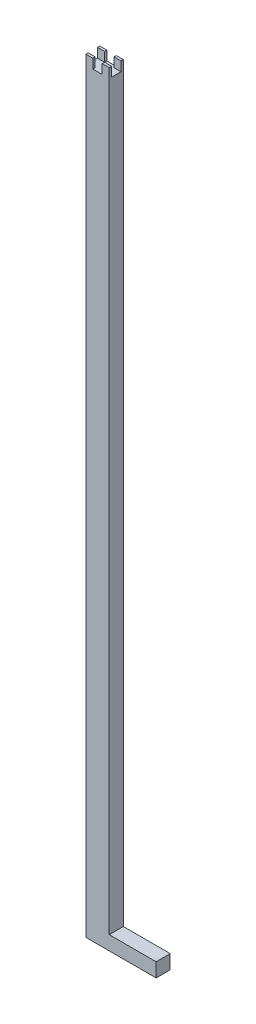
ISO-10303-21;
HEADER;
FILE_DESCRIPTION(('STEP AP214'),'2;1');
FILE_NAME('part.step','',(''),(''),'','','');
FILE_SCHEMA(('AUTOMOTIVE_DESIGN { 1 0 10303 214 1 1 1 1 }'));
ENDSEC;
DATA;
#1=APPLICATION_CONTEXT('core data for automotive mechanical design processes');
#2=APPLICATION_PROTOCOL_DEFINITION('international standard','automotive_design',2000,#1);
#3=PRODUCT_CONTEXT('',#1,'mechanical');
#4=PRODUCT('Part','Part','',(#3));
#5=PRODUCT_RELATED_PRODUCT_CATEGORY('part','',(#4));
#6=PRODUCT_DEFINITION_FORMATION('','',#4);
#7=PRODUCT_DEFINITION_CONTEXT('part definition',#1,'design');
#8=PRODUCT_DEFINITION('design','',#6,#7);
#9=PRODUCT_DEFINITION_SHAPE('','',#8);
#10=(LENGTH_UNIT() NAMED_UNIT(*) SI_UNIT(.MILLI.,.METRE.));
#11=(NAMED_UNIT(*) PLANE_ANGLE_UNIT() SI_UNIT($,.RADIAN.));
#12=(NAMED_UNIT(*) SI_UNIT($,.STERADIAN.) SOLID_ANGLE_UNIT());
#13=UNCERTAINTY_MEASURE_WITH_UNIT(LENGTH_MEASURE(1.E-05),#10,'distance_accuracy_value','');
#14=(GEOMETRIC_REPRESENTATION_CONTEXT(3) GLOBAL_UNCERTAINTY_ASSIGNED_CONTEXT((#13)) GLOBAL_UNIT_ASSIGNED_CONTEXT((#10,
#11,#12)) REPRESENTATION_CONTEXT('',''));
#15=CARTESIAN_POINT('',(0.,0.,0.));
#16=DIRECTION('',(0.,0.,1.));
#17=DIRECTION('',(1.,0.,0.));
#18=AXIS2_PLACEMENT_3D('',#15,#16,#17);
#19=CARTESIAN_POINT('',(0.,163.,0.));
#20=DIRECTION('',(0.,1.,0.));
#21=DIRECTION('',(0.,0.,1.));
#22=AXIS2_PLACEMENT_3D('',#19,#20,#21);
#23=PLANE('',#22);
#24=DIRECTION('',(0.,0.,-1.));
#25=VECTOR('',#24,1.);
#26=CARTESIAN_POINT('',(-4.,163.,-0.999999999999999));
#27=LINE('',#26,#25);
#28=CARTESIAN_POINT('',(-4.,163.,-0.999999999999999));
#29=VERTEX_POINT('',#28);
#30=CARTESIAN_POINT('',(-4.,163.,-1.5));
#31=VERTEX_POINT('',#30);
#32=EDGE_CURVE('E180',#29,#31,#27,.T.);
#33=ORIENTED_EDGE('',*,*,#32,.F.);
#34=DIRECTION('',(-1.,0.,0.));
#35=VECTOR('',#34,1.);
#36=CARTESIAN_POINT('',(-2.5,163.,-0.999999999999999));
#37=LINE('',#36,#35);
#38=CARTESIAN_POINT('',(-2.5,163.,-0.999999999999999));
#39=VERTEX_POINT('',#38);
#40=EDGE_CURVE('E182',#39,#29,#37,.T.);
#41=ORIENTED_EDGE('',*,*,#40,.F.);
#42=DIRECTION('',(0.,0.,-1.));
#43=VECTOR('',#42,1.);
#44=CARTESIAN_POINT('',(-2.5,163.,-1.5));
#45=LINE('',#44,#43);
#46=CARTESIAN_POINT('',(-2.5,163.,-1.5));
#47=VERTEX_POINT('',#46);
#48=EDGE_CURVE('E257',#39,#47,#45,.T.);
#49=ORIENTED_EDGE('',*,*,#48,.T.);
#50=DIRECTION('',(-1.,0.,0.));
#51=VECTOR('',#50,1.);
#52=CARTESIAN_POINT('',(-7.5,163.,-1.5));
#53=LINE('',#52,#51);
#54=EDGE_CURVE('E262',#47,#31,#53,.T.);
#55=ORIENTED_EDGE('',*,*,#54,.T.);
#56=EDGE_LOOP('',(#33,#41,#49,#55));
#57=FACE_BOUND('',#56,.T.);
#58=ADVANCED_FACE('F34',(#57),#23,.T.);
#59=DIRECTION('',(1.,0.,0.));
#60=VECTOR('',#59,1.);
#61=CARTESIAN_POINT('',(-2.5,163.,1.));
#62=LINE('',#61,#60);
#63=CARTESIAN_POINT('',(-4.,163.,1.));
#64=VERTEX_POINT('',#63);
#65=CARTESIAN_POINT('',(-2.5,163.,1.));
#66=VERTEX_POINT('',#65);
#67=EDGE_CURVE('E221',#64,#66,#62,.T.);
#68=ORIENTED_EDGE('',*,*,#67,.F.);
#69=DIRECTION('',(0.,0.,-1.));
#70=VECTOR('',#69,1.);
#71=CARTESIAN_POINT('',(-4.,163.,1.5));
#72=LINE('',#71,#70);
#73=CARTESIAN_POINT('',(-4.,163.,1.5));
#74=VERTEX_POINT('',#73);
#75=EDGE_CURVE('E218',#74,#64,#72,.T.);
#76=ORIENTED_EDGE('',*,*,#75,.F.);
#77=DIRECTION('',(1.,0.,0.));
#78=VECTOR('',#77,1.);
#79=CARTESIAN_POINT('',(-7.5,163.,1.5));
#80=LINE('',#79,#78);
#81=CARTESIAN_POINT('',(-2.5,163.,1.5));
#82=VERTEX_POINT('',#81);
#83=EDGE_CURVE('E252',#74,#82,#80,.T.);
#84=ORIENTED_EDGE('',*,*,#83,.T.);
#85=EDGE_CURVE('E258',#82,#66,#45,.T.);
#86=ORIENTED_EDGE('',*,*,#85,.T.);
#87=EDGE_LOOP('',(#68,#76,#84,#86));
#88=FACE_BOUND('',#87,.T.);
#89=ADVANCED_FACE('F334',(#88),#23,.T.);
#90=DIRECTION('',(0.,0.,1.));
#91=VECTOR('',#90,1.);
#92=CARTESIAN_POINT('',(-6.,163.,1.5));
#93=LINE('',#92,#91);
#94=CARTESIAN_POINT('',(-6.,163.,1.));
#95=VERTEX_POINT('',#94);
#96=CARTESIAN_POINT('',(-6.,163.,1.5));
#97=VERTEX_POINT('',#96);
#98=EDGE_CURVE('E216',#95,#97,#93,.T.);
#99=ORIENTED_EDGE('',*,*,#98,.F.);
#100=DIRECTION('',(1.,0.,0.));
#101=VECTOR('',#100,1.);
#102=CARTESIAN_POINT('',(-6.,163.,1.));
#103=LINE('',#102,#101);
#104=CARTESIAN_POINT('',(-7.5,163.,1.));
#105=VERTEX_POINT('',#104);
#106=EDGE_CURVE('E213',#105,#95,#103,.T.);
#107=ORIENTED_EDGE('',*,*,#106,.F.);
#108=DIRECTION('',(0.,0.,1.));
#109=VECTOR('',#108,1.);
#110=CARTESIAN_POINT('',(-7.5,163.,-1.5));
#111=LINE('',#110,#109);
#112=CARTESIAN_POINT('',(-7.5,163.,1.5));
#113=VERTEX_POINT('',#112);
#114=EDGE_CURVE('E253',#105,#113,#111,.T.);
#115=ORIENTED_EDGE('',*,*,#114,.T.);
#116=EDGE_CURVE('E254',#113,#97,#80,.T.);
#117=ORIENTED_EDGE('',*,*,#116,.T.);
#118=EDGE_LOOP('',(#99,#107,#115,#117));
#119=FACE_BOUND('',#118,.T.);
#120=ADVANCED_FACE('F347',(#119),#23,.T.);
#121=CARTESIAN_POINT('',(-7.5,3.,1.5));
#122=DIRECTION('',(1.,0.,0.));
#123=DIRECTION('',(0.,0.,-1.));
#124=AXIS2_PLACEMENT_3D('',#121,#122,#123);
#125=PLANE('',#124);
#126=ORIENTED_EDGE('',*,*,#114,.F.);
#127=DIRECTION('',(0.,1.,0.));
#128=VECTOR('',#127,1.);
#129=CARTESIAN_POINT('',(-7.5,161.,1.));
#130=LINE('',#129,#128);
#131=CARTESIAN_POINT('',(-7.5,161.,1.));
#132=VERTEX_POINT('',#131);
#133=EDGE_CURVE('E246',#132,#105,#130,.T.);
#134=ORIENTED_EDGE('',*,*,#133,.F.);
#135=DIRECTION('',(0.,0.,1.));
#136=VECTOR('',#135,1.);
#137=CARTESIAN_POINT('',(-7.5,161.,1.));
#138=LINE('',#137,#136);
#139=CARTESIAN_POINT('',(-7.5,161.,-0.999999999999999));
#140=VERTEX_POINT('',#139);
#141=EDGE_CURVE('E174',#140,#132,#138,.T.);
#142=ORIENTED_EDGE('',*,*,#141,.F.);
#143=DIRECTION('',(0.,1.,0.));
#144=VECTOR('',#143,1.);
#145=CARTESIAN_POINT('',(-7.5,161.,-0.999999999999999));
#146=LINE('',#145,#144);
#147=CARTESIAN_POINT('',(-7.5,163.,-0.999999999999999));
#148=VERTEX_POINT('',#147);
#149=EDGE_CURVE('E164',#140,#148,#146,.T.);
#150=ORIENTED_EDGE('',*,*,#149,.T.);
#151=CARTESIAN_POINT('',(-7.5,163.,-1.5));
#152=VERTEX_POINT('',#151);
#153=EDGE_CURVE('E249',#152,#148,#111,.T.);
#154=ORIENTED_EDGE('',*,*,#153,.F.);
#155=DIRECTION('',(0.,-1.,0.));
#156=VECTOR('',#155,1.);
#157=CARTESIAN_POINT('',(-7.5,3.,-1.5));
#158=LINE('',#157,#156);
#159=CARTESIAN_POINT('',(-7.5,0.,-1.5));
#160=VERTEX_POINT('',#159);
#161=EDGE_CURVE('E280',#152,#160,#158,.T.);
#162=ORIENTED_EDGE('',*,*,#161,.T.);
#163=DIRECTION('',(0.,0.,1.));
#164=VECTOR('',#163,1.);
#165=CARTESIAN_POINT('',(-7.5,0.,1.5));
#166=LINE('',#165,#164);
#167=CARTESIAN_POINT('',(-7.5,0.,1.5));
#168=VERTEX_POINT('',#167);
#169=EDGE_CURVE('E272',#160,#168,#166,.T.);
#170=ORIENTED_EDGE('',*,*,#169,.T.);
#171=DIRECTION('',(0.,-1.,0.));
#172=VECTOR('',#171,1.);
#173=CARTESIAN_POINT('',(-7.5,3.,1.5));
#174=LINE('',#173,#172);
#175=EDGE_CURVE('E11',#113,#168,#174,.T.);
#176=ORIENTED_EDGE('',*,*,#175,.F.);
#177=EDGE_LOOP('',(#126,#134,#142,#150,#154,#162,#170,#176));
#178=FACE_BOUND('',#177,.T.);
#179=ADVANCED_FACE('F36',(#178),#125,.F.);
#180=CARTESIAN_POINT('',(7.5,3.,1.5));
#181=DIRECTION('',(0.,0.,-1.));
#182=DIRECTION('',(-1.,0.,0.));
#183=AXIS2_PLACEMENT_3D('',#180,#181,#182);
#184=PLANE('',#183);
#185=ORIENTED_EDGE('',*,*,#83,.F.);
#186=DIRECTION('',(0.,1.,0.));
#187=VECTOR('',#186,1.);
#188=CARTESIAN_POINT('',(-4.,161.,1.5));
#189=LINE('',#188,#187);
#190=CARTESIAN_POINT('',(-4.,161.,1.5));
#191=VERTEX_POINT('',#190);
#192=EDGE_CURVE('E239',#191,#74,#189,.T.);
#193=ORIENTED_EDGE('',*,*,#192,.F.);
#194=DIRECTION('',(1.,0.,0.));
#195=VECTOR('',#194,1.);
#196=CARTESIAN_POINT('',(-4.,161.,1.5));
#197=LINE('',#196,#195);
#198=CARTESIAN_POINT('',(-6.,161.,1.5));
#199=VERTEX_POINT('',#198);
#200=EDGE_CURVE('E192',#199,#191,#197,.T.);
#201=ORIENTED_EDGE('',*,*,#200,.F.);
#202=DIRECTION('',(0.,1.,0.));
#203=VECTOR('',#202,1.);
#204=CARTESIAN_POINT('',(-6.,161.,1.5));
#205=LINE('',#204,#203);
#206=EDGE_CURVE('E241',#199,#97,#205,.T.);
#207=ORIENTED_EDGE('',*,*,#206,.T.);
#208=ORIENTED_EDGE('',*,*,#116,.F.);
#209=ORIENTED_EDGE('',*,*,#175,.T.);
#210=DIRECTION('',(1.,0.,0.));
#211=VECTOR('',#210,1.);
#212=CARTESIAN_POINT('',(7.5,0.,1.5));
#213=LINE('',#212,#211);
#214=CARTESIAN_POINT('',(7.5,0.,1.5));
#215=VERTEX_POINT('',#214);
#216=EDGE_CURVE('E283',#168,#215,#213,.T.);
#217=ORIENTED_EDGE('',*,*,#216,.T.);
#218=DIRECTION('',(0.,-1.,0.));
#219=VECTOR('',#218,1.);
#220=CARTESIAN_POINT('',(7.5,3.,1.5));
#221=LINE('',#220,#219);
#222=CARTESIAN_POINT('',(7.5,3.,1.5));
#223=VERTEX_POINT('',#222);
#224=EDGE_CURVE('E42',#223,#215,#221,.T.);
#225=ORIENTED_EDGE('',*,*,#224,.F.);
#226=DIRECTION('',(1.,0.,0.));
#227=VECTOR('',#226,1.);
#228=CARTESIAN_POINT('',(7.5,3.,1.5));
#229=LINE('',#228,#227);
#230=CARTESIAN_POINT('',(-2.5,3.,1.5));
#231=VERTEX_POINT('',#230);
#232=EDGE_CURVE('E273',#231,#223,#229,.T.);
#233=ORIENTED_EDGE('',*,*,#232,.F.);
#234=DIRECTION('',(0.,-1.,0.));
#235=VECTOR('',#234,1.);
#236=CARTESIAN_POINT('',(-2.5,163.,1.5));
#237=LINE('',#236,#235);
#238=EDGE_CURVE('E269',#82,#231,#237,.T.);
#239=ORIENTED_EDGE('',*,*,#238,.F.);
#240=EDGE_LOOP('',(#185,#193,#201,#207,#208,#209,#217,#225,#233,#239));
#241=FACE_BOUND('',#240,.T.);
#242=ADVANCED_FACE('F329',(#241),#184,.F.);
#243=CARTESIAN_POINT('',(7.5,3.,1.5));
#244=DIRECTION('',(-1.,0.,0.));
#245=DIRECTION('',(0.,0.,1.));
#246=AXIS2_PLACEMENT_3D('',#243,#244,#245);
#247=PLANE('',#246);
#248=DIRECTION('',(0.,0.,-1.));
#249=VECTOR('',#248,1.);
#250=CARTESIAN_POINT('',(7.5,0.,1.5));
#251=LINE('',#250,#249);
#252=CARTESIAN_POINT('',(7.5,0.,-1.5));
#253=VERTEX_POINT('',#252);
#254=EDGE_CURVE('E285',#215,#253,#251,.T.);
#255=ORIENTED_EDGE('',*,*,#254,.T.);
#256=DIRECTION('',(0.,-1.,0.));
#257=VECTOR('',#256,1.);
#258=CARTESIAN_POINT('',(7.5,3.,-1.5));
#259=LINE('',#258,#257);
#260=CARTESIAN_POINT('',(7.5,3.,-1.5));
#261=VERTEX_POINT('',#260);
#262=EDGE_CURVE('E290',#261,#253,#259,.T.);
#263=ORIENTED_EDGE('',*,*,#262,.F.);
#264=DIRECTION('',(0.,0.,-1.));
#265=VECTOR('',#264,1.);
#266=CARTESIAN_POINT('',(7.5,3.,1.5));
#267=LINE('',#266,#265);
#268=EDGE_CURVE('E275',#223,#261,#267,.T.);
#269=ORIENTED_EDGE('',*,*,#268,.F.);
#270=ORIENTED_EDGE('',*,*,#224,.T.);
#271=EDGE_LOOP('',(#255,#263,#269,#270));
#272=FACE_BOUND('',#271,.T.);
#273=ADVANCED_FACE('F297',(#272),#247,.F.);
#274=CARTESIAN_POINT('',(7.5,3.,-1.5));
#275=DIRECTION('',(0.,0.,1.));
#276=DIRECTION('',(1.,0.,0.));
#277=AXIS2_PLACEMENT_3D('',#274,#275,#276);
#278=PLANE('',#277);
#279=CARTESIAN_POINT('',(-6.,163.,-1.5));
#280=VERTEX_POINT('',#279);
#281=EDGE_CURVE('E261',#280,#152,#53,.T.);
#282=ORIENTED_EDGE('',*,*,#281,.F.);
#283=DIRECTION('',(0.,1.,0.));
#284=VECTOR('',#283,1.);
#285=CARTESIAN_POINT('',(-6.,161.,-1.5));
#286=LINE('',#285,#284);
#287=CARTESIAN_POINT('',(-6.,161.,-1.5));
#288=VERTEX_POINT('',#287);
#289=EDGE_CURVE('E225',#288,#280,#286,.T.);
#290=ORIENTED_EDGE('',*,*,#289,.F.);
#291=DIRECTION('',(-1.,0.,0.));
#292=VECTOR('',#291,1.);
#293=CARTESIAN_POINT('',(-4.,161.,-1.5));
#294=LINE('',#293,#292);
#295=CARTESIAN_POINT('',(-4.,161.,-1.5));
#296=VERTEX_POINT('',#295);
#297=EDGE_CURVE('E165',#296,#288,#294,.T.);
#298=ORIENTED_EDGE('',*,*,#297,.F.);
#299=DIRECTION('',(0.,1.,0.));
#300=VECTOR('',#299,1.);
#301=CARTESIAN_POINT('',(-4.,161.,-1.5));
#302=LINE('',#301,#300);
#303=EDGE_CURVE('E227',#296,#31,#302,.T.);
#304=ORIENTED_EDGE('',*,*,#303,.T.);
#305=ORIENTED_EDGE('',*,*,#54,.F.);
#306=DIRECTION('',(0.,-1.,0.));
#307=VECTOR('',#306,1.);
#308=CARTESIAN_POINT('',(-2.5,163.,-1.5));
#309=LINE('',#308,#307);
#310=CARTESIAN_POINT('',(-2.5,3.,-1.5));
#311=VERTEX_POINT('',#310);
#312=EDGE_CURVE('E265',#47,#311,#309,.T.);
#313=ORIENTED_EDGE('',*,*,#312,.T.);
#314=DIRECTION('',(-1.,0.,0.));
#315=VECTOR('',#314,1.);
#316=CARTESIAN_POINT('',(7.5,3.,-1.5));
#317=LINE('',#316,#315);
#318=EDGE_CURVE('E278',#261,#311,#317,.T.);
#319=ORIENTED_EDGE('',*,*,#318,.F.);
#320=ORIENTED_EDGE('',*,*,#262,.T.);
#321=DIRECTION('',(-1.,0.,0.));
#322=VECTOR('',#321,1.);
#323=CARTESIAN_POINT('',(7.5,0.,-1.5));
#324=LINE('',#323,#322);
#325=EDGE_CURVE('E276',#253,#160,#324,.T.);
#326=ORIENTED_EDGE('',*,*,#325,.T.);
#327=ORIENTED_EDGE('',*,*,#161,.F.);
#328=EDGE_LOOP('',(#282,#290,#298,#304,#305,#313,#319,#320,#326,#327));
#329=FACE_BOUND('',#328,.T.);
#330=ADVANCED_FACE('F307',(#329),#278,.F.);
#331=CARTESIAN_POINT('',(0.,3.,0.));
#332=DIRECTION('',(0.,1.,0.));
#333=DIRECTION('',(0.,0.,1.));
#334=AXIS2_PLACEMENT_3D('',#331,#332,#333);
#335=PLANE('',#334);
#336=DIRECTION('',(0.,0.,-1.));
#337=VECTOR('',#336,1.);
#338=CARTESIAN_POINT('',(-2.5,3.,-1.5));
#339=LINE('',#338,#337);
#340=EDGE_CURVE('E57',#231,#311,#339,.T.);
#341=ORIENTED_EDGE('',*,*,#340,.F.);
#342=ORIENTED_EDGE('',*,*,#232,.T.);
#343=ORIENTED_EDGE('',*,*,#268,.T.);
#344=ORIENTED_EDGE('',*,*,#318,.T.);
#345=EDGE_LOOP('',(#341,#342,#343,#344));
#346=FACE_BOUND('',#345,.T.);
#347=ADVANCED_FACE('F326',(#346),#335,.T.);
#348=CARTESIAN_POINT('',(0.,0.,0.));
#349=DIRECTION('',(0.,1.,0.));
#350=DIRECTION('',(0.,0.,1.));
#351=AXIS2_PLACEMENT_3D('',#348,#349,#350);
#352=PLANE('',#351);
#353=ORIENTED_EDGE('',*,*,#169,.F.);
#354=ORIENTED_EDGE('',*,*,#325,.F.);
#355=ORIENTED_EDGE('',*,*,#254,.F.);
#356=ORIENTED_EDGE('',*,*,#216,.F.);
#357=EDGE_LOOP('',(#353,#354,#355,#356));
#358=FACE_BOUND('',#357,.T.);
#359=ADVANCED_FACE('F303',(#358),#352,.F.);
#360=CARTESIAN_POINT('',(-2.5,163.,-1.5));
#361=DIRECTION('',(-1.,0.,0.));
#362=DIRECTION('',(0.,0.,1.));
#363=AXIS2_PLACEMENT_3D('',#360,#361,#362);
#364=PLANE('',#363);
#365=ORIENTED_EDGE('',*,*,#48,.F.);
#366=DIRECTION('',(0.,1.,0.));
#367=VECTOR('',#366,1.);
#368=CARTESIAN_POINT('',(-2.5,161.,-0.999999999999999));
#369=LINE('',#368,#367);
#370=CARTESIAN_POINT('',(-2.5,161.,-0.999999999999999));
#371=VERTEX_POINT('',#370);
#372=EDGE_CURVE('E232',#371,#39,#369,.T.);
#373=ORIENTED_EDGE('',*,*,#372,.F.);
#374=DIRECTION('',(0.,0.,-1.));
#375=VECTOR('',#374,1.);
#376=CARTESIAN_POINT('',(-2.5,161.,1.));
#377=LINE('',#376,#375);
#378=CARTESIAN_POINT('',(-2.5,161.,1.));
#379=VERTEX_POINT('',#378);
#380=EDGE_CURVE('E201',#379,#371,#377,.T.);
#381=ORIENTED_EDGE('',*,*,#380,.F.);
#382=DIRECTION('',(0.,1.,0.));
#383=VECTOR('',#382,1.);
#384=CARTESIAN_POINT('',(-2.5,161.,1.));
#385=LINE('',#384,#383);
#386=EDGE_CURVE('E234',#379,#66,#385,.T.);
#387=ORIENTED_EDGE('',*,*,#386,.T.);
#388=ORIENTED_EDGE('',*,*,#85,.F.);
#389=ORIENTED_EDGE('',*,*,#238,.T.);
#390=ORIENTED_EDGE('',*,*,#340,.T.);
#391=ORIENTED_EDGE('',*,*,#312,.F.);
#392=EDGE_LOOP('',(#365,#373,#381,#387,#388,#389,#390,#391));
#393=FACE_BOUND('',#392,.T.);
#394=ADVANCED_FACE('F325',(#393),#364,.F.);
#395=DIRECTION('',(0.,0.,1.));
#396=VECTOR('',#395,1.);
#397=CARTESIAN_POINT('',(-6.,163.,-0.999999999999999));
#398=LINE('',#397,#396);
#399=CARTESIAN_POINT('',(-6.,163.,-0.999999999999999));
#400=VERTEX_POINT('',#399);
#401=EDGE_CURVE('E49',#280,#400,#398,.T.);
#402=ORIENTED_EDGE('',*,*,#401,.F.);
#403=ORIENTED_EDGE('',*,*,#281,.T.);
#404=ORIENTED_EDGE('',*,*,#153,.T.);
#405=DIRECTION('',(-1.,0.,0.));
#406=VECTOR('',#405,1.);
#407=CARTESIAN_POINT('',(-6.,163.,-0.999999999999999));
#408=LINE('',#407,#406);
#409=EDGE_CURVE('E211',#400,#148,#408,.T.);
#410=ORIENTED_EDGE('',*,*,#409,.F.);
#411=EDGE_LOOP('',(#402,#403,#404,#410));
#412=FACE_BOUND('',#411,.T.);
#413=ADVANCED_FACE('F314',(#412),#23,.T.);
#414=CARTESIAN_POINT('',(-6.,161.,-0.999999999999999));
#415=DIRECTION('',(-1.,0.,0.));
#416=DIRECTION('',(0.,0.,1.));
#417=AXIS2_PLACEMENT_3D('',#414,#415,#416);
#418=PLANE('',#417);
#419=ORIENTED_EDGE('',*,*,#401,.T.);
#420=DIRECTION('',(0.,1.,0.));
#421=VECTOR('',#420,1.);
#422=CARTESIAN_POINT('',(-6.,161.,-0.999999999999999));
#423=LINE('',#422,#421);
#424=CARTESIAN_POINT('',(-6.,161.,-0.999999999999999));
#425=VERTEX_POINT('',#424);
#426=EDGE_CURVE('E156',#425,#400,#423,.T.);
#427=ORIENTED_EDGE('',*,*,#426,.F.);
#428=DIRECTION('',(0.,0.,1.));
#429=VECTOR('',#428,1.);
#430=CARTESIAN_POINT('',(-6.,161.,-0.999999999999999));
#431=LINE('',#430,#429);
#432=EDGE_CURVE('E160',#288,#425,#431,.T.);
#433=ORIENTED_EDGE('',*,*,#432,.F.);
#434=ORIENTED_EDGE('',*,*,#289,.T.);
#435=EDGE_LOOP('',(#419,#427,#433,#434));
#436=FACE_BOUND('',#435,.T.);
#437=ADVANCED_FACE('F158',(#436),#418,.F.);
#438=CARTESIAN_POINT('',(-4.,161.,-0.999999999999999));
#439=DIRECTION('',(1.,0.,0.));
#440=DIRECTION('',(0.,0.,-1.));
#441=AXIS2_PLACEMENT_3D('',#438,#439,#440);
#442=PLANE('',#441);
#443=ORIENTED_EDGE('',*,*,#32,.T.);
#444=ORIENTED_EDGE('',*,*,#303,.F.);
#445=DIRECTION('',(0.,0.,-1.));
#446=VECTOR('',#445,1.);
#447=CARTESIAN_POINT('',(-4.,161.,-0.999999999999999));
#448=LINE('',#447,#446);
#449=CARTESIAN_POINT('',(-4.,161.,-0.999999999999999));
#450=VERTEX_POINT('',#449);
#451=EDGE_CURVE('E207',#450,#296,#448,.T.);
#452=ORIENTED_EDGE('',*,*,#451,.F.);
#453=DIRECTION('',(0.,1.,0.));
#454=VECTOR('',#453,1.);
#455=CARTESIAN_POINT('',(-4.,161.,-0.999999999999999));
#456=LINE('',#455,#454);
#457=EDGE_CURVE('E230',#450,#29,#456,.T.);
#458=ORIENTED_EDGE('',*,*,#457,.T.);
#459=EDGE_LOOP('',(#443,#444,#452,#458));
#460=FACE_BOUND('',#459,.T.);
#461=ADVANCED_FACE('F372',(#460),#442,.F.);
#462=CARTESIAN_POINT('',(-2.5,161.,-0.999999999999999));
#463=DIRECTION('',(0.,0.,-1.));
#464=DIRECTION('',(-1.,0.,0.));
#465=AXIS2_PLACEMENT_3D('',#462,#463,#464);
#466=PLANE('',#465);
#467=ORIENTED_EDGE('',*,*,#40,.T.);
#468=ORIENTED_EDGE('',*,*,#457,.F.);
#469=DIRECTION('',(-1.,0.,0.));
#470=VECTOR('',#469,1.);
#471=CARTESIAN_POINT('',(-2.5,161.,-0.999999999999999));
#472=LINE('',#471,#470);
#473=EDGE_CURVE('E204',#371,#450,#472,.T.);
#474=ORIENTED_EDGE('',*,*,#473,.F.);
#475=ORIENTED_EDGE('',*,*,#372,.T.);
#476=EDGE_LOOP('',(#467,#468,#474,#475));
#477=FACE_BOUND('',#476,.T.);
#478=ADVANCED_FACE('F426',(#477),#466,.F.);
#479=CARTESIAN_POINT('',(-2.5,161.,1.));
#480=DIRECTION('',(0.,0.,1.));
#481=DIRECTION('',(1.,0.,0.));
#482=AXIS2_PLACEMENT_3D('',#479,#480,#481);
#483=PLANE('',#482);
#484=ORIENTED_EDGE('',*,*,#67,.T.);
#485=ORIENTED_EDGE('',*,*,#386,.F.);
#486=DIRECTION('',(1.,0.,0.));
#487=VECTOR('',#486,1.);
#488=CARTESIAN_POINT('',(-2.5,161.,1.));
#489=LINE('',#488,#487);
#490=CARTESIAN_POINT('',(-4.,161.,1.));
#491=VERTEX_POINT('',#490);
#492=EDGE_CURVE('E198',#491,#379,#489,.T.);
#493=ORIENTED_EDGE('',*,*,#492,.F.);
#494=DIRECTION('',(0.,1.,0.));
#495=VECTOR('',#494,1.);
#496=CARTESIAN_POINT('',(-4.,161.,1.));
#497=LINE('',#496,#495);
#498=EDGE_CURVE('E237',#491,#64,#497,.T.);
#499=ORIENTED_EDGE('',*,*,#498,.T.);
#500=EDGE_LOOP('',(#484,#485,#493,#499));
#501=FACE_BOUND('',#500,.T.);
#502=ADVANCED_FACE('F435',(#501),#483,.F.);
#503=CARTESIAN_POINT('',(-4.,161.,1.5));
#504=DIRECTION('',(1.,0.,0.));
#505=DIRECTION('',(0.,0.,-1.));
#506=AXIS2_PLACEMENT_3D('',#503,#504,#505);
#507=PLANE('',#506);
#508=ORIENTED_EDGE('',*,*,#75,.T.);
#509=ORIENTED_EDGE('',*,*,#498,.F.);
#510=DIRECTION('',(0.,0.,-1.));
#511=VECTOR('',#510,1.);
#512=CARTESIAN_POINT('',(-4.,161.,1.5));
#513=LINE('',#512,#511);
#514=EDGE_CURVE('E195',#191,#491,#513,.T.);
#515=ORIENTED_EDGE('',*,*,#514,.F.);
#516=ORIENTED_EDGE('',*,*,#192,.T.);
#517=EDGE_LOOP('',(#508,#509,#515,#516));
#518=FACE_BOUND('',#517,.T.);
#519=ADVANCED_FACE('F339',(#518),#507,.F.);
#520=CARTESIAN_POINT('',(-6.,161.,1.5));
#521=DIRECTION('',(-1.,0.,0.));
#522=DIRECTION('',(0.,0.,1.));
#523=AXIS2_PLACEMENT_3D('',#520,#521,#522);
#524=PLANE('',#523);
#525=ORIENTED_EDGE('',*,*,#98,.T.);
#526=ORIENTED_EDGE('',*,*,#206,.F.);
#527=DIRECTION('',(0.,0.,1.));
#528=VECTOR('',#527,1.);
#529=CARTESIAN_POINT('',(-6.,161.,1.5));
#530=LINE('',#529,#528);
#531=CARTESIAN_POINT('',(-6.,161.,1.));
#532=VERTEX_POINT('',#531);
#533=EDGE_CURVE('E189',#532,#199,#530,.T.);
#534=ORIENTED_EDGE('',*,*,#533,.F.);
#535=DIRECTION('',(0.,1.,0.));
#536=VECTOR('',#535,1.);
#537=CARTESIAN_POINT('',(-6.,161.,1.));
#538=LINE('',#537,#536);
#539=EDGE_CURVE('E244',#532,#95,#538,.T.);
#540=ORIENTED_EDGE('',*,*,#539,.T.);
#541=EDGE_LOOP('',(#525,#526,#534,#540));
#542=FACE_BOUND('',#541,.T.);
#543=ADVANCED_FACE('F343',(#542),#524,.F.);
#544=CARTESIAN_POINT('',(-6.,161.,1.));
#545=DIRECTION('',(0.,0.,1.));
#546=DIRECTION('',(1.,0.,0.));
#547=AXIS2_PLACEMENT_3D('',#544,#545,#546);
#548=PLANE('',#547);
#549=ORIENTED_EDGE('',*,*,#106,.T.);
#550=ORIENTED_EDGE('',*,*,#539,.F.);
#551=DIRECTION('',(1.,0.,0.));
#552=VECTOR('',#551,1.);
#553=CARTESIAN_POINT('',(-6.,161.,1.));
#554=LINE('',#553,#552);
#555=EDGE_CURVE('E186',#132,#532,#554,.T.);
#556=ORIENTED_EDGE('',*,*,#555,.F.);
#557=ORIENTED_EDGE('',*,*,#133,.T.);
#558=EDGE_LOOP('',(#549,#550,#556,#557));
#559=FACE_BOUND('',#558,.T.);
#560=ADVANCED_FACE('F351',(#559),#548,.F.);
#561=CARTESIAN_POINT('',(-6.,161.,-0.999999999999999));
#562=DIRECTION('',(0.,0.,-1.));
#563=DIRECTION('',(-1.,0.,0.));
#564=AXIS2_PLACEMENT_3D('',#561,#562,#563);
#565=PLANE('',#564);
#566=ORIENTED_EDGE('',*,*,#409,.T.);
#567=ORIENTED_EDGE('',*,*,#149,.F.);
#568=DIRECTION('',(-1.,0.,0.));
#569=VECTOR('',#568,1.);
#570=CARTESIAN_POINT('',(-6.,161.,-0.999999999999999));
#571=LINE('',#570,#569);
#572=EDGE_CURVE('E168',#425,#140,#571,.T.);
#573=ORIENTED_EDGE('',*,*,#572,.F.);
#574=ORIENTED_EDGE('',*,*,#426,.T.);
#575=EDGE_LOOP('',(#566,#567,#573,#574));
#576=FACE_BOUND('',#575,.T.);
#577=ADVANCED_FACE('F169',(#576),#565,.F.);
#578=CARTESIAN_POINT('',(0.,161.,0.));
#579=DIRECTION('',(0.,1.,0.));
#580=DIRECTION('',(0.,0.,1.));
#581=AXIS2_PLACEMENT_3D('',#578,#579,#580);
#582=PLANE('',#581);
#583=ORIENTED_EDGE('',*,*,#432,.T.);
#584=ORIENTED_EDGE('',*,*,#572,.T.);
#585=ORIENTED_EDGE('',*,*,#141,.T.);
#586=ORIENTED_EDGE('',*,*,#555,.T.);
#587=ORIENTED_EDGE('',*,*,#533,.T.);
#588=ORIENTED_EDGE('',*,*,#200,.T.);
#589=ORIENTED_EDGE('',*,*,#514,.T.);
#590=ORIENTED_EDGE('',*,*,#492,.T.);
#591=ORIENTED_EDGE('',*,*,#380,.T.);
#592=ORIENTED_EDGE('',*,*,#473,.T.);
#593=ORIENTED_EDGE('',*,*,#451,.T.);
#594=ORIENTED_EDGE('',*,*,#297,.T.);
#595=EDGE_LOOP('',(#583,#584,#585,#586,#587,#588,#589,#590,#591,#592,#593,#594));
#596=FACE_BOUND('',#595,.T.);
#597=ADVANCED_FACE('F176',(#596),#582,.T.);
#598=CLOSED_SHELL('',(#58,#89,#120,#179,#242,#273,#330,#347,#359,#394,#413,#437,#461,#478,#502,
#519,#543,#560,#577,#597));
#599=MANIFOLD_SOLID_BREP('B2',#598);
#600=ADVANCED_BREP_SHAPE_REPRESENTATION('',(#18,#599),#14);
#601=SHAPE_DEFINITION_REPRESENTATION(#9,#600);
ENDSEC;
END-ISO-10303-21;
